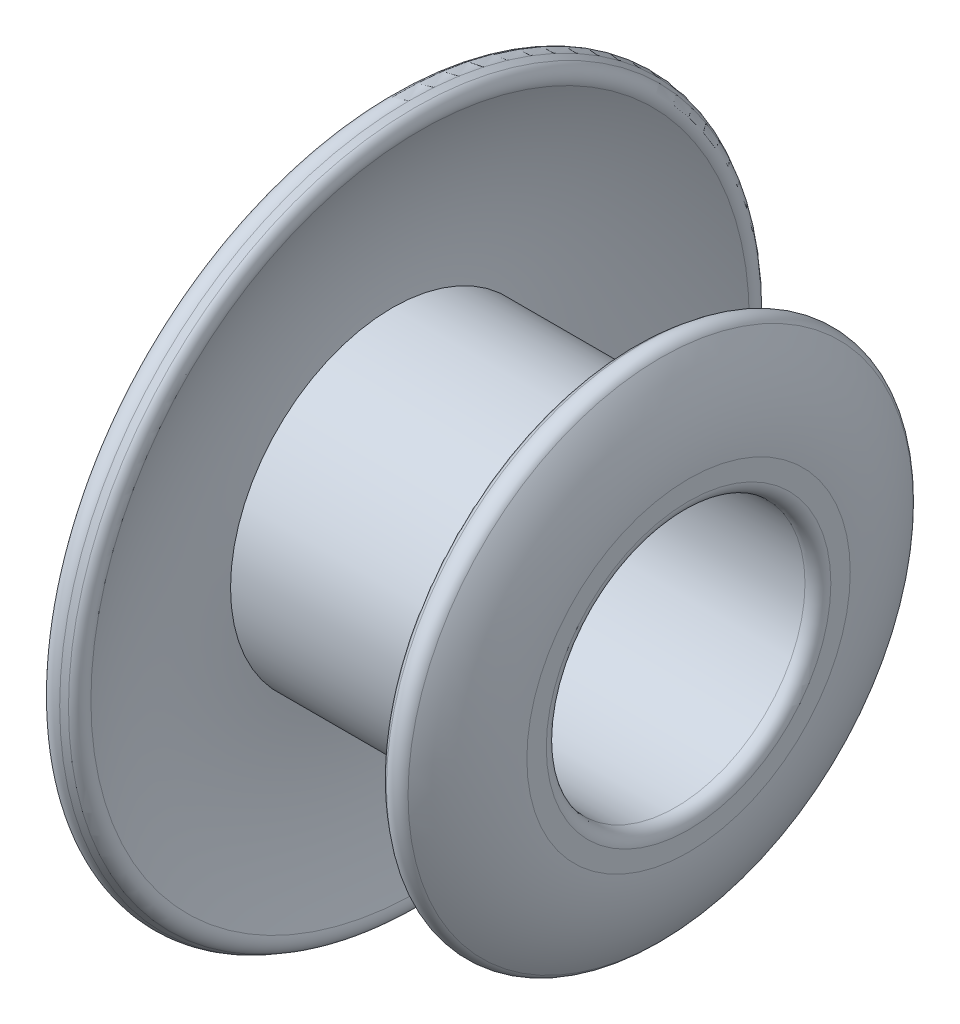
ISO-10303-21;
HEADER;
FILE_DESCRIPTION(('STEP AP214'),'2;1');
FILE_NAME('part.step','',(''),(''),'','','');
FILE_SCHEMA(('AUTOMOTIVE_DESIGN { 1 0 10303 214 1 1 1 1 }'));
ENDSEC;
DATA;
#1=APPLICATION_CONTEXT('core data for automotive mechanical design processes');
#2=APPLICATION_PROTOCOL_DEFINITION('international standard','automotive_design',2000,#1);
#3=PRODUCT_CONTEXT('',#1,'mechanical');
#4=PRODUCT('Part','Part','',(#3));
#5=PRODUCT_RELATED_PRODUCT_CATEGORY('part','',(#4));
#6=PRODUCT_DEFINITION_FORMATION('','',#4);
#7=PRODUCT_DEFINITION_CONTEXT('part definition',#1,'design');
#8=PRODUCT_DEFINITION('design','',#6,#7);
#9=PRODUCT_DEFINITION_SHAPE('','',#8);
#10=(LENGTH_UNIT() NAMED_UNIT(*) SI_UNIT(.MILLI.,.METRE.));
#11=(NAMED_UNIT(*) PLANE_ANGLE_UNIT() SI_UNIT($,.RADIAN.));
#12=(NAMED_UNIT(*) SI_UNIT($,.STERADIAN.) SOLID_ANGLE_UNIT());
#13=UNCERTAINTY_MEASURE_WITH_UNIT(LENGTH_MEASURE(1.E-05),#10,'distance_accuracy_value','');
#14=(GEOMETRIC_REPRESENTATION_CONTEXT(3) GLOBAL_UNCERTAINTY_ASSIGNED_CONTEXT((#13)) GLOBAL_UNIT_ASSIGNED_CONTEXT((#10,
#11,#12)) REPRESENTATION_CONTEXT('',''));
#15=CARTESIAN_POINT('',(0.,0.,0.));
#16=DIRECTION('',(0.,0.,1.));
#17=DIRECTION('',(1.,0.,0.));
#18=AXIS2_PLACEMENT_3D('',#15,#16,#17);
#19=CARTESIAN_POINT('',(-1.,0.,0.));
#20=DIRECTION('',(1.,0.,0.));
#21=DIRECTION('',(0.,0.,-1.));
#22=AXIS2_PLACEMENT_3D('',#19,#20,#21);
#23=TOROIDAL_SURFACE('',#22,1.25,1.);
#24=CARTESIAN_POINT('',(-0.170578942903163,0.,0.));
#25=DIRECTION('',(-1.,0.,0.));
#26=DIRECTION('',(0.,0.,1.));
#27=AXIS2_PLACEMENT_3D('',#24,#25,#26);
#28=CIRCLE('',#27,1.80862394331461);
#29=CARTESIAN_POINT('',(-0.170578942903163,0.,1.80862394331461));
#30=VERTEX_POINT('',#29);
#31=EDGE_CURVE('E48',#30,#30,#28,.T.);
#32=ORIENTED_EDGE('',*,*,#31,.T.);
#33=EDGE_LOOP('',(#32));
#34=FACE_BOUND('',#33,.T.);
#35=CARTESIAN_POINT('',(0.,0.,0.));
#36=DIRECTION('',(1.,0.,0.));
#37=DIRECTION('',(0.,0.,-1.));
#38=AXIS2_PLACEMENT_3D('',#35,#36,#37);
#39=CIRCLE('',#38,1.25);
#40=CARTESIAN_POINT('',(0.,0.,-1.25));
#41=VERTEX_POINT('',#40);
#42=EDGE_CURVE('E77',#41,#41,#39,.T.);
#43=ORIENTED_EDGE('',*,*,#42,.T.);
#44=EDGE_LOOP('',(#43));
#45=FACE_BOUND('',#44,.T.);
#46=ADVANCED_FACE('F33',(#34,#45),#23,.F.);
#47=CARTESIAN_POINT('',(0.,0.,0.));
#48=DIRECTION('',(1.,0.,0.));
#49=DIRECTION('',(0.,0.,-1.));
#50=AXIS2_PLACEMENT_3D('',#47,#48,#49);
#51=CYLINDRICAL_SURFACE('',#50,1.25);
#52=CARTESIAN_POINT('',(-2.04063984282907,0.,0.));
#53=DIRECTION('',(1.,0.,0.));
#54=DIRECTION('',(0.,0.,-1.));
#55=AXIS2_PLACEMENT_3D('',#52,#53,#54);
#56=CIRCLE('',#55,1.25);
#57=CARTESIAN_POINT('',(-2.04063984282907,0.,-1.25));
#58=VERTEX_POINT('',#57);
#59=EDGE_CURVE('E80',#58,#58,#56,.T.);
#60=ORIENTED_EDGE('',*,*,#59,.T.);
#61=EDGE_LOOP('',(#60));
#62=FACE_BOUND('',#61,.T.);
#63=ORIENTED_EDGE('',*,*,#42,.F.);
#64=EDGE_LOOP('',(#63));
#65=FACE_BOUND('',#64,.T.);
#66=ADVANCED_FACE('F105',(#62,#65),#51,.T.);
#67=CARTESIAN_POINT('',(0.190032397181517,0.,0.));
#68=DIRECTION('',(1.,0.,0.));
#69=DIRECTION('',(0.,0.,-1.));
#70=AXIS2_PLACEMENT_3D('',#67,#68,#69);
#71=DEGENERATE_TOROIDAL_SURFACE('',#70,1.54428108611693,2.25,.T.);
#72=CARTESIAN_POINT('',(-1.82538787646011,0.,0.));
#73=DIRECTION('',(1.,0.,0.));
#74=DIRECTION('',(0.,0.,-1.));
#75=AXIS2_PLACEMENT_3D('',#72,#73,#74);
#76=CIRCLE('',#75,2.54457160421371);
#77=CARTESIAN_POINT('',(-1.82538787646011,0.,-2.54457160421371));
#78=VERTEX_POINT('',#77);
#79=EDGE_CURVE('E10',#78,#78,#76,.T.);
#80=ORIENTED_EDGE('',*,*,#79,.T.);
#81=EDGE_LOOP('',(#80));
#82=FACE_BOUND('',#81,.T.);
#83=ORIENTED_EDGE('',*,*,#59,.F.);
#84=EDGE_LOOP('',(#83));
#85=FACE_BOUND('',#84,.T.);
#86=ADVANCED_FACE('F111',(#82,#85),#71,.F.);
#87=CARTESIAN_POINT('',(-2.,0.,0.));
#88=DIRECTION('',(-1.,0.,0.));
#89=DIRECTION('',(0.,0.,1.));
#90=AXIS2_PLACEMENT_3D('',#87,#88,#89);
#91=CONICAL_SURFACE('',#90,2.75,0.503264178510874);
#92=CARTESIAN_POINT('',(-1.91057288431433,0.,0.));
#93=DIRECTION('',(1.,0.,0.));
#94=DIRECTION('',(0.,0.,-1.));
#95=AXIS2_PLACEMENT_3D('',#92,#93,#94);
#96=CIRCLE('',#95,2.70076604120789);
#97=CARTESIAN_POINT('',(-1.91057288431433,0.,-2.70076604120789));
#98=VERTEX_POINT('',#97);
#99=EDGE_CURVE('E40',#98,#98,#96,.T.);
#100=ORIENTED_EDGE('',*,*,#99,.T.);
#101=EDGE_LOOP('',(#100));
#102=FACE_BOUND('',#101,.T.);
#103=CARTESIAN_POINT('',(-1.86673335428885,0.,0.));
#104=DIRECTION('',(-1.,0.,0.));
#105=DIRECTION('',(0.,0.,1.));
#106=AXIS2_PLACEMENT_3D('',#103,#104,#105);
#107=CIRCLE('',#106,2.67663025646083);
#108=CARTESIAN_POINT('',(-1.86673335428885,0.,2.67663025646083));
#109=VERTEX_POINT('',#108);
#110=EDGE_CURVE('E44',#109,#109,#107,.T.);
#111=ORIENTED_EDGE('',*,*,#110,.T.);
#112=EDGE_LOOP('',(#111));
#113=FACE_BOUND('',#112,.T.);
#114=ADVANCED_FACE('F143',(#102,#113),#91,.T.);
#115=CARTESIAN_POINT('',(0.190032397181517,0.,0.));
#116=DIRECTION('',(1.,0.,0.));
#117=DIRECTION('',(0.,0.,-1.));
#118=AXIS2_PLACEMENT_3D('',#115,#116,#117);
#119=DEGENERATE_TOROIDAL_SURFACE('',#118,1.54428108611693,2.5,.T.);
#120=CARTESIAN_POINT('',(-2.26675876734259,0.,0.));
#121=DIRECTION('',(1.,0.,0.));
#122=DIRECTION('',(0.,0.,-1.));
#123=AXIS2_PLACEMENT_3D('',#120,#121,#122);
#124=CIRCLE('',#123,1.08148828807846);
#125=CARTESIAN_POINT('',(-2.26675876734259,0.,-1.08148828807846));
#126=VERTEX_POINT('',#125);
#127=EDGE_CURVE('E71',#126,#126,#124,.T.);
#128=ORIENTED_EDGE('',*,*,#127,.T.);
#129=EDGE_LOOP('',(#128));
#130=FACE_BOUND('',#129,.T.);
#131=CARTESIAN_POINT('',(-2.04833639245512,0.,0.));
#132=DIRECTION('',(1.,0.,0.));
#133=DIRECTION('',(0.,0.,-1.));
#134=AXIS2_PLACEMENT_3D('',#131,#132,#133);
#135=CIRCLE('',#134,2.65770156445412);
#136=CARTESIAN_POINT('',(-2.04833639245512,0.,-2.65770156445412));
#137=VERTEX_POINT('',#136);
#138=EDGE_CURVE('E74',#137,#137,#135,.F.);
#139=ORIENTED_EDGE('',*,*,#138,.T.);
#140=EDGE_LOOP('',(#139));
#141=FACE_BOUND('',#140,.T.);
#142=ADVANCED_FACE('F141',(#130,#141),#119,.T.);
#143=CARTESIAN_POINT('',(0.,0.,0.));
#144=DIRECTION('',(1.,0.,0.));
#145=DIRECTION('',(0.,0.,-1.));
#146=AXIS2_PLACEMENT_3D('',#143,#144,#145);
#147=CYLINDRICAL_SURFACE('',#146,1.);
#148=CARTESIAN_POINT('',(-2.16848712076163,0.,0.));
#149=DIRECTION('',(-1.,0.,0.));
#150=DIRECTION('',(0.,0.,1.));
#151=AXIS2_PLACEMENT_3D('',#148,#149,#150);
#152=CIRCLE('',#151,1.);
#153=CARTESIAN_POINT('',(-2.16848712076163,0.,1.));
#154=VERTEX_POINT('',#153);
#155=EDGE_CURVE('E65',#154,#154,#152,.T.);
#156=ORIENTED_EDGE('',*,*,#155,.T.);
#157=EDGE_LOOP('',(#156));
#158=FACE_BOUND('',#157,.T.);
#159=CARTESIAN_POINT('',(0.15,0.,0.));
#160=DIRECTION('',(1.,0.,0.));
#161=DIRECTION('',(0.,0.,-1.));
#162=AXIS2_PLACEMENT_3D('',#159,#160,#161);
#163=CIRCLE('',#162,1.);
#164=CARTESIAN_POINT('',(0.15,0.,-1.));
#165=VERTEX_POINT('',#164);
#166=EDGE_CURVE('E68',#165,#165,#163,.T.);
#167=ORIENTED_EDGE('',*,*,#166,.T.);
#168=EDGE_LOOP('',(#167));
#169=FACE_BOUND('',#168,.T.);
#170=ADVANCED_FACE('F101',(#158,#169),#147,.F.);
#171=CARTESIAN_POINT('',(0.25,0.,0.));
#172=DIRECTION('',(1.,0.,0.));
#173=DIRECTION('',(0.,0.,-1.));
#174=AXIS2_PLACEMENT_3D('',#171,#172,#173);
#175=PLANE('',#174);
#176=CARTESIAN_POINT('',(0.25,0.,0.));
#177=DIRECTION('',(1.,0.,0.));
#178=DIRECTION('',(0.,0.,-1.));
#179=AXIS2_PLACEMENT_3D('',#176,#177,#178);
#180=CIRCLE('',#179,1.1);
#181=CARTESIAN_POINT('',(0.25,0.,-1.1));
#182=VERTEX_POINT('',#181);
#183=EDGE_CURVE('E62',#182,#182,#180,.F.);
#184=ORIENTED_EDGE('',*,*,#183,.T.);
#185=EDGE_LOOP('',(#184));
#186=FACE_BOUND('',#185,.T.);
#187=CARTESIAN_POINT('',(0.25,0.,0.));
#188=DIRECTION('',(1.,0.,0.));
#189=DIRECTION('',(0.,0.,-1.));
#190=AXIS2_PLACEMENT_3D('',#187,#188,#189);
#191=CIRCLE('',#190,1.25);
#192=CARTESIAN_POINT('',(0.25,0.,-1.25));
#193=VERTEX_POINT('',#192);
#194=EDGE_CURVE('E83',#193,#193,#191,.T.);
#195=ORIENTED_EDGE('',*,*,#194,.T.);
#196=EDGE_LOOP('',(#195));
#197=FACE_BOUND('',#196,.T.);
#198=ADVANCED_FACE('F87',(#186,#197),#175,.T.);
#199=CARTESIAN_POINT('',(-1.,0.,0.));
#200=DIRECTION('',(1.,0.,0.));
#201=DIRECTION('',(0.,0.,-1.));
#202=AXIS2_PLACEMENT_3D('',#199,#200,#201);
#203=DEGENERATE_TOROIDAL_SURFACE('',#202,1.25,1.25,.T.);
#204=CARTESIAN_POINT('',(0.0339971841705924,0.,0.));
#205=DIRECTION('',(-1.,0.,0.));
#206=DIRECTION('',(0.,0.,1.));
#207=AXIS2_PLACEMENT_3D('',#204,#205,#206);
#208=CIRCLE('',#207,1.95238865532359);
#209=CARTESIAN_POINT('',(0.0339971841705924,0.,1.95238865532359));
#210=VERTEX_POINT('',#209);
#211=EDGE_CURVE('E59',#210,#210,#208,.F.);
#212=ORIENTED_EDGE('',*,*,#211,.T.);
#213=EDGE_LOOP('',(#212));
#214=FACE_BOUND('',#213,.T.);
#215=ORIENTED_EDGE('',*,*,#194,.F.);
#216=EDGE_LOOP('',(#215));
#217=FACE_BOUND('',#216,.T.);
#218=ADVANCED_FACE('F89',(#214,#217),#203,.T.);
#219=CARTESIAN_POINT('',(-0.0309967602818487,0.,0.));
#220=DIRECTION('',(1.,0.,0.));
#221=DIRECTION('',(0.,0.,-1.));
#222=AXIS2_PLACEMENT_3D('',#219,#220,#221);
#223=CONICAL_SURFACE('',#222,2.03964088129714,0.683760592480567);
#224=CARTESIAN_POINT('',(-0.111893861066826,0.,0.));
#225=DIRECTION('',(-1.,0.,0.));
#226=DIRECTION('',(0.,0.,1.));
#227=AXIS2_PLACEMENT_3D('',#224,#225,#226);
#228=CIRCLE('',#227,1.97371782207516);
#229=CARTESIAN_POINT('',(-0.111893861066826,0.,1.97371782207516));
#230=VERTEX_POINT('',#229);
#231=EDGE_CURVE('E53',#230,#230,#228,.T.);
#232=ORIENTED_EDGE('',*,*,#231,.T.);
#233=EDGE_LOOP('',(#232));
#234=FACE_BOUND('',#233,.T.);
#235=CARTESIAN_POINT('',(-0.150808107697252,0.,0.));
#236=DIRECTION('',(1.,0.,0.));
#237=DIRECTION('',(0.,0.,-1.));
#238=AXIS2_PLACEMENT_3D('',#235,#236,#237);
#239=CIRCLE('',#238,1.94200659682353);
#240=CARTESIAN_POINT('',(-0.150808107697252,0.,-1.94200659682353));
#241=VERTEX_POINT('',#240);
#242=EDGE_CURVE('E56',#241,#241,#239,.T.);
#243=ORIENTED_EDGE('',*,*,#242,.T.);
#244=EDGE_LOOP('',(#243));
#245=FACE_BOUND('',#244,.T.);
#246=ADVANCED_FACE('F91',(#234,#245),#223,.T.);
#247=CARTESIAN_POINT('',(-2.16848712076163,0.,0.));
#248=DIRECTION('',(-1.,0.,0.));
#249=DIRECTION('',(0.,0.,1.));
#250=AXIS2_PLACEMENT_3D('',#247,#248,#249);
#251=TOROIDAL_SURFACE('',#250,1.1,0.1);
#252=ORIENTED_EDGE('',*,*,#155,.F.);
#253=EDGE_LOOP('',(#252));
#254=FACE_BOUND('',#253,.T.);
#255=ORIENTED_EDGE('',*,*,#127,.F.);
#256=EDGE_LOOP('',(#255));
#257=FACE_BOUND('',#256,.T.);
#258=ADVANCED_FACE('F98',(#254,#257),#251,.T.);
#259=CARTESIAN_POINT('',(0.15,0.,0.));
#260=DIRECTION('',(1.,0.,0.));
#261=DIRECTION('',(0.,0.,-1.));
#262=AXIS2_PLACEMENT_3D('',#259,#260,#261);
#263=TOROIDAL_SURFACE('',#262,1.1,0.1);
#264=ORIENTED_EDGE('',*,*,#183,.F.);
#265=EDGE_LOOP('',(#264));
#266=FACE_BOUND('',#265,.T.);
#267=ORIENTED_EDGE('',*,*,#166,.F.);
#268=EDGE_LOOP('',(#267));
#269=FACE_BOUND('',#268,.T.);
#270=ADVANCED_FACE('F119',(#266,#269),#263,.T.);
#271=CARTESIAN_POINT('',(-0.048722590563055,0.,0.));
#272=DIRECTION('',(-1.,0.,0.));
#273=DIRECTION('',(0.,0.,1.));
#274=AXIS2_PLACEMENT_3D('',#271,#272,#273);
#275=TOROIDAL_SURFACE('',#274,1.89619756289771,0.1);
#276=ORIENTED_EDGE('',*,*,#231,.F.);
#277=EDGE_LOOP('',(#276));
#278=FACE_BOUND('',#277,.T.);
#279=ORIENTED_EDGE('',*,*,#211,.F.);
#280=EDGE_LOOP('',(#279));
#281=FACE_BOUND('',#280,.T.);
#282=ADVANCED_FACE('F123',(#278,#281),#275,.T.);
#283=CARTESIAN_POINT('',(-0.0876368371934808,0.,0.));
#284=DIRECTION('',(-1.,0.,0.));
#285=DIRECTION('',(0.,0.,1.));
#286=AXIS2_PLACEMENT_3D('',#283,#284,#285);
#287=TOROIDAL_SURFACE('',#286,1.86448633764607,0.1);
#288=ORIENTED_EDGE('',*,*,#31,.F.);
#289=EDGE_LOOP('',(#288));
#290=FACE_BOUND('',#289,.T.);
#291=ORIENTED_EDGE('',*,*,#242,.F.);
#292=EDGE_LOOP('',(#291));
#293=FACE_BOUND('',#292,.T.);
#294=ADVANCED_FACE('F127',(#290,#293),#287,.T.);
#295=CARTESIAN_POINT('',(-1.95880164086965,0.,0.));
#296=DIRECTION('',(-1.,0.,0.));
#297=DIRECTION('',(0.,0.,1.));
#298=AXIS2_PLACEMENT_3D('',#295,#296,#297);
#299=TOROIDAL_SURFACE('',#298,2.61316474532063,0.1);
#300=ORIENTED_EDGE('',*,*,#138,.F.);
#301=EDGE_LOOP('',(#300));
#302=FACE_BOUND('',#301,.T.);
#303=ORIENTED_EDGE('',*,*,#99,.F.);
#304=EDGE_LOOP('',(#303));
#305=FACE_BOUND('',#304,.T.);
#306=ADVANCED_FACE('F130',(#302,#305),#299,.T.);
#307=CARTESIAN_POINT('',(-1.91496211084418,0.,0.));
#308=DIRECTION('',(-1.,0.,0.));
#309=DIRECTION('',(0.,0.,1.));
#310=AXIS2_PLACEMENT_3D('',#307,#308,#309);
#311=TOROIDAL_SURFACE('',#310,2.58902896057357,0.1);
#312=ORIENTED_EDGE('',*,*,#110,.F.);
#313=EDGE_LOOP('',(#312));
#314=FACE_BOUND('',#313,.T.);
#315=ORIENTED_EDGE('',*,*,#79,.F.);
#316=EDGE_LOOP('',(#315));
#317=FACE_BOUND('',#316,.T.);
#318=ADVANCED_FACE('F35',(#314,#317),#311,.T.);
#319=CLOSED_SHELL('',(#46,#66,#86,#114,#142,#170,#198,#218,#246,#258,#270,#282,#294,#306,#318));
#320=MANIFOLD_SOLID_BREP('B2',#319);
#321=ADVANCED_BREP_SHAPE_REPRESENTATION('',(#18,#320),#14);
#322=SHAPE_DEFINITION_REPRESENTATION(#9,#321);
ENDSEC;
END-ISO-10303-21;
